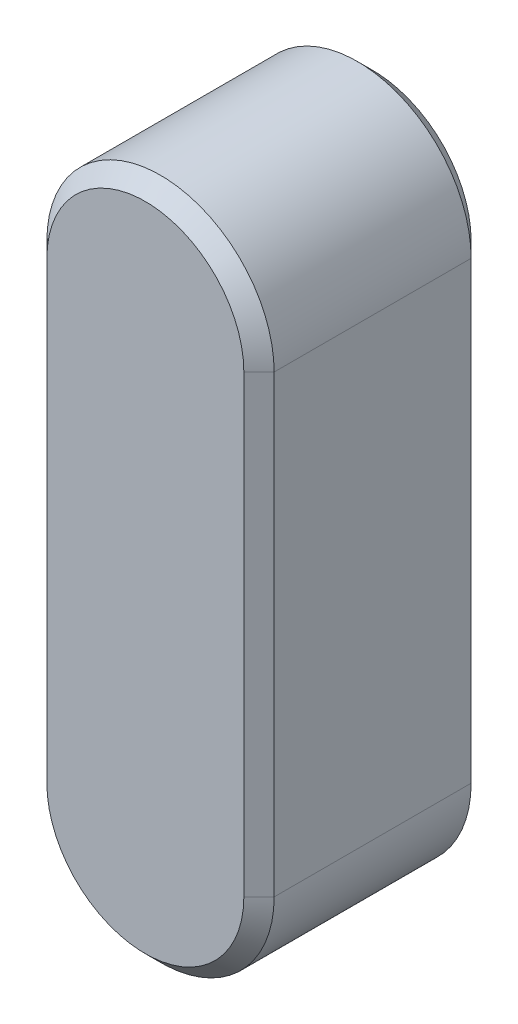
ISO-10303-21;
HEADER;
FILE_DESCRIPTION(('STEP AP214'),'2;1');
FILE_NAME('part.step','',(''),(''),'','','');
FILE_SCHEMA(('AUTOMOTIVE_DESIGN { 1 0 10303 214 1 1 1 1 }'));
ENDSEC;
DATA;
#1=APPLICATION_CONTEXT('core data for automotive mechanical design processes');
#2=APPLICATION_PROTOCOL_DEFINITION('international standard','automotive_design',2000,#1);
#3=PRODUCT_CONTEXT('',#1,'mechanical');
#4=PRODUCT('Part','Part','',(#3));
#5=PRODUCT_RELATED_PRODUCT_CATEGORY('part','',(#4));
#6=PRODUCT_DEFINITION_FORMATION('','',#4);
#7=PRODUCT_DEFINITION_CONTEXT('part definition',#1,'design');
#8=PRODUCT_DEFINITION('design','',#6,#7);
#9=PRODUCT_DEFINITION_SHAPE('','',#8);
#10=(LENGTH_UNIT() NAMED_UNIT(*) SI_UNIT(.MILLI.,.METRE.));
#11=(NAMED_UNIT(*) PLANE_ANGLE_UNIT() SI_UNIT($,.RADIAN.));
#12=(NAMED_UNIT(*) SI_UNIT($,.STERADIAN.) SOLID_ANGLE_UNIT());
#13=UNCERTAINTY_MEASURE_WITH_UNIT(LENGTH_MEASURE(1.E-05),#10,'distance_accuracy_value','');
#14=(GEOMETRIC_REPRESENTATION_CONTEXT(3) GLOBAL_UNCERTAINTY_ASSIGNED_CONTEXT((#13)) GLOBAL_UNIT_ASSIGNED_CONTEXT((#10,
#11,#12)) REPRESENTATION_CONTEXT('',''));
#15=CARTESIAN_POINT('',(0.,0.,0.));
#16=DIRECTION('',(0.,0.,1.));
#17=DIRECTION('',(1.,0.,0.));
#18=AXIS2_PLACEMENT_3D('',#15,#16,#17);
#19=CARTESIAN_POINT('',(0.,0.,3.));
#20=DIRECTION('',(0.,0.,-1.));
#21=DIRECTION('',(-1.,0.,0.));
#22=AXIS2_PLACEMENT_3D('',#19,#20,#21);
#23=CYLINDRICAL_SURFACE('',#22,1.5);
#24=DIRECTION('',(0.,0.,-1.));
#25=VECTOR('',#24,1.);
#26=CARTESIAN_POINT('',(-1.5,0.,3.));
#27=LINE('',#26,#25);
#28=CARTESIAN_POINT('',(-1.5,0.,2.8));
#29=VERTEX_POINT('',#28);
#30=CARTESIAN_POINT('',(-1.5,0.,0.200000000000001));
#31=VERTEX_POINT('',#30);
#32=EDGE_CURVE('E158',#29,#31,#27,.T.);
#33=ORIENTED_EDGE('',*,*,#32,.T.);
#34=CARTESIAN_POINT('',(0.,0.,0.200000000000001));
#35=DIRECTION('',(0.,0.,1.));
#36=DIRECTION('',(1.,0.,0.));
#37=AXIS2_PLACEMENT_3D('',#34,#35,#36);
#38=CIRCLE('',#37,1.5);
#39=CARTESIAN_POINT('',(1.5,0.,0.200000000000001));
#40=VERTEX_POINT('',#39);
#41=EDGE_CURVE('E172',#31,#40,#38,.T.);
#42=ORIENTED_EDGE('',*,*,#41,.T.);
#43=DIRECTION('',(0.,0.,-1.));
#44=VECTOR('',#43,1.);
#45=CARTESIAN_POINT('',(1.5,0.,3.));
#46=LINE('',#45,#44);
#47=CARTESIAN_POINT('',(1.5,0.,2.8));
#48=VERTEX_POINT('',#47);
#49=EDGE_CURVE('E129',#48,#40,#46,.T.);
#50=ORIENTED_EDGE('',*,*,#49,.F.);
#51=CARTESIAN_POINT('',(0.,0.,2.8));
#52=DIRECTION('',(0.,0.,1.));
#53=DIRECTION('',(1.,0.,0.));
#54=AXIS2_PLACEMENT_3D('',#51,#52,#53);
#55=CIRCLE('',#54,1.5);
#56=EDGE_CURVE('E175',#48,#29,#55,.F.);
#57=ORIENTED_EDGE('',*,*,#56,.T.);
#58=EDGE_LOOP('',(#33,#42,#50,#57));
#59=FACE_BOUND('',#58,.T.);
#60=ADVANCED_FACE('F39',(#59),#23,.T.);
#61=CARTESIAN_POINT('',(1.5,0.,3.));
#62=DIRECTION('',(-1.,0.,0.));
#63=DIRECTION('',(0.,0.,1.));
#64=AXIS2_PLACEMENT_3D('',#61,#62,#63);
#65=PLANE('',#64);
#66=ORIENTED_EDGE('',*,*,#49,.T.);
#67=DIRECTION('',(0.,1.,0.));
#68=VECTOR('',#67,1.);
#69=CARTESIAN_POINT('',(1.5,0.,0.200000000000001));
#70=LINE('',#69,#68);
#71=CARTESIAN_POINT('',(1.5,6.,0.200000000000001));
#72=VERTEX_POINT('',#71);
#73=EDGE_CURVE('E127',#40,#72,#70,.T.);
#74=ORIENTED_EDGE('',*,*,#73,.T.);
#75=DIRECTION('',(0.,0.,-1.));
#76=VECTOR('',#75,1.);
#77=CARTESIAN_POINT('',(1.5,6.,3.));
#78=LINE('',#77,#76);
#79=CARTESIAN_POINT('',(1.5,6.,2.8));
#80=VERTEX_POINT('',#79);
#81=EDGE_CURVE('E109',#80,#72,#78,.T.);
#82=ORIENTED_EDGE('',*,*,#81,.F.);
#83=DIRECTION('',(0.,-1.,0.));
#84=VECTOR('',#83,1.);
#85=CARTESIAN_POINT('',(1.5,0.,2.8));
#86=LINE('',#85,#84);
#87=EDGE_CURVE('E124',#80,#48,#86,.T.);
#88=ORIENTED_EDGE('',*,*,#87,.T.);
#89=EDGE_LOOP('',(#66,#74,#82,#88));
#90=FACE_BOUND('',#89,.T.);
#91=ADVANCED_FACE('F123',(#90),#65,.F.);
#92=CARTESIAN_POINT('',(0.,6.,3.));
#93=DIRECTION('',(0.,0.,-1.));
#94=DIRECTION('',(-1.,0.,0.));
#95=AXIS2_PLACEMENT_3D('',#92,#93,#94);
#96=CYLINDRICAL_SURFACE('',#95,1.5);
#97=ORIENTED_EDGE('',*,*,#81,.T.);
#98=CARTESIAN_POINT('',(0.,6.,0.200000000000001));
#99=DIRECTION('',(0.,0.,1.));
#100=DIRECTION('',(1.,0.,0.));
#101=AXIS2_PLACEMENT_3D('',#98,#99,#100);
#102=CIRCLE('',#101,1.5);
#103=CARTESIAN_POINT('',(-1.5,6.,0.200000000000001));
#104=VERTEX_POINT('',#103);
#105=EDGE_CURVE('E116',#72,#104,#102,.T.);
#106=ORIENTED_EDGE('',*,*,#105,.T.);
#107=DIRECTION('',(0.,0.,-1.));
#108=VECTOR('',#107,1.);
#109=CARTESIAN_POINT('',(-1.5,6.,3.));
#110=LINE('',#109,#108);
#111=CARTESIAN_POINT('',(-1.5,6.,2.8));
#112=VERTEX_POINT('',#111);
#113=EDGE_CURVE('E111',#112,#104,#110,.T.);
#114=ORIENTED_EDGE('',*,*,#113,.F.);
#115=CARTESIAN_POINT('',(0.,6.,2.8));
#116=DIRECTION('',(0.,0.,1.));
#117=DIRECTION('',(1.,0.,0.));
#118=AXIS2_PLACEMENT_3D('',#115,#116,#117);
#119=CIRCLE('',#118,1.5);
#120=EDGE_CURVE('E106',#112,#80,#119,.F.);
#121=ORIENTED_EDGE('',*,*,#120,.T.);
#122=EDGE_LOOP('',(#97,#106,#114,#121));
#123=FACE_BOUND('',#122,.T.);
#124=ADVANCED_FACE('F108',(#123),#96,.T.);
#125=CARTESIAN_POINT('',(-1.5,0.,3.));
#126=DIRECTION('',(1.,0.,0.));
#127=DIRECTION('',(0.,0.,-1.));
#128=AXIS2_PLACEMENT_3D('',#125,#126,#127);
#129=PLANE('',#128);
#130=ORIENTED_EDGE('',*,*,#113,.T.);
#131=DIRECTION('',(0.,-1.,0.));
#132=VECTOR('',#131,1.);
#133=CARTESIAN_POINT('',(-1.5,0.,0.200000000000001));
#134=LINE('',#133,#132);
#135=EDGE_CURVE('E178',#104,#31,#134,.T.);
#136=ORIENTED_EDGE('',*,*,#135,.T.);
#137=ORIENTED_EDGE('',*,*,#32,.F.);
#138=DIRECTION('',(0.,1.,0.));
#139=VECTOR('',#138,1.);
#140=CARTESIAN_POINT('',(-1.5,6.,2.8));
#141=LINE('',#140,#139);
#142=EDGE_CURVE('E181',#29,#112,#141,.T.);
#143=ORIENTED_EDGE('',*,*,#142,.T.);
#144=EDGE_LOOP('',(#130,#136,#137,#143));
#145=FACE_BOUND('',#144,.T.);
#146=ADVANCED_FACE('F229',(#145),#129,.F.);
#147=CARTESIAN_POINT('',(0.,0.,3.));
#148=DIRECTION('',(0.,0.,1.));
#149=DIRECTION('',(1.,0.,0.));
#150=AXIS2_PLACEMENT_3D('',#147,#148,#149);
#151=PLANE('',#150);
#152=CARTESIAN_POINT('',(0.,6.,3.));
#153=DIRECTION('',(0.,0.,1.));
#154=DIRECTION('',(1.,0.,0.));
#155=AXIS2_PLACEMENT_3D('',#152,#153,#154);
#156=CIRCLE('',#155,1.3);
#157=CARTESIAN_POINT('',(1.3,6.,3.));
#158=VERTEX_POINT('',#157);
#159=CARTESIAN_POINT('',(-1.3,6.,3.));
#160=VERTEX_POINT('',#159);
#161=EDGE_CURVE('E49',#158,#160,#156,.T.);
#162=ORIENTED_EDGE('',*,*,#161,.T.);
#163=DIRECTION('',(0.,-1.,0.));
#164=VECTOR('',#163,1.);
#165=CARTESIAN_POINT('',(-1.3,0.,3.));
#166=LINE('',#165,#164);
#167=CARTESIAN_POINT('',(-1.3,0.,3.));
#168=VERTEX_POINT('',#167);
#169=EDGE_CURVE('E11',#160,#168,#166,.T.);
#170=ORIENTED_EDGE('',*,*,#169,.T.);
#171=CARTESIAN_POINT('',(0.,0.,3.));
#172=DIRECTION('',(0.,0.,1.));
#173=DIRECTION('',(1.,0.,0.));
#174=AXIS2_PLACEMENT_3D('',#171,#172,#173);
#175=CIRCLE('',#174,1.3);
#176=CARTESIAN_POINT('',(1.3,0.,3.));
#177=VERTEX_POINT('',#176);
#178=EDGE_CURVE('E169',#168,#177,#175,.T.);
#179=ORIENTED_EDGE('',*,*,#178,.T.);
#180=DIRECTION('',(0.,1.,0.));
#181=VECTOR('',#180,1.);
#182=CARTESIAN_POINT('',(1.3,6.,3.));
#183=LINE('',#182,#181);
#184=EDGE_CURVE('E60',#177,#158,#183,.T.);
#185=ORIENTED_EDGE('',*,*,#184,.T.);
#186=EDGE_LOOP('',(#162,#170,#179,#185));
#187=FACE_BOUND('',#186,.T.);
#188=ADVANCED_FACE('F235',(#187),#151,.T.);
#189=CARTESIAN_POINT('',(0.,0.,0.));
#190=DIRECTION('',(0.,0.,1.));
#191=DIRECTION('',(1.,0.,0.));
#192=AXIS2_PLACEMENT_3D('',#189,#190,#191);
#193=PLANE('',#192);
#194=CARTESIAN_POINT('',(0.,6.,0.));
#195=DIRECTION('',(0.,0.,1.));
#196=DIRECTION('',(1.,0.,0.));
#197=AXIS2_PLACEMENT_3D('',#194,#195,#196);
#198=CIRCLE('',#197,1.3);
#199=CARTESIAN_POINT('',(-1.3,6.,0.));
#200=VERTEX_POINT('',#199);
#201=CARTESIAN_POINT('',(1.3,6.,0.));
#202=VERTEX_POINT('',#201);
#203=EDGE_CURVE('E189',#200,#202,#198,.F.);
#204=ORIENTED_EDGE('',*,*,#203,.T.);
#205=DIRECTION('',(0.,-1.,0.));
#206=VECTOR('',#205,1.);
#207=CARTESIAN_POINT('',(1.3,0.,0.));
#208=LINE('',#207,#206);
#209=CARTESIAN_POINT('',(1.3,0.,0.));
#210=VERTEX_POINT('',#209);
#211=EDGE_CURVE('E117',#202,#210,#208,.T.);
#212=ORIENTED_EDGE('',*,*,#211,.T.);
#213=CARTESIAN_POINT('',(0.,0.,0.));
#214=DIRECTION('',(0.,0.,1.));
#215=DIRECTION('',(1.,0.,0.));
#216=AXIS2_PLACEMENT_3D('',#213,#214,#215);
#217=CIRCLE('',#216,1.3);
#218=CARTESIAN_POINT('',(-1.3,0.,0.));
#219=VERTEX_POINT('',#218);
#220=EDGE_CURVE('E195',#210,#219,#217,.F.);
#221=ORIENTED_EDGE('',*,*,#220,.T.);
#222=DIRECTION('',(0.,1.,0.));
#223=VECTOR('',#222,1.);
#224=CARTESIAN_POINT('',(-1.3,0.,0.));
#225=LINE('',#224,#223);
#226=EDGE_CURVE('E192',#219,#200,#225,.T.);
#227=ORIENTED_EDGE('',*,*,#226,.T.);
#228=EDGE_LOOP('',(#204,#212,#221,#227));
#229=FACE_BOUND('',#228,.T.);
#230=ADVANCED_FACE('F237',(#229),#193,.F.);
#231=CARTESIAN_POINT('',(-1.5,0.,0.200000000000001));
#232=DIRECTION('',(0.707106781186547,0.,0.707106781186548));
#233=DIRECTION('',(0.,-1.,0.));
#234=AXIS2_PLACEMENT_3D('',#231,#232,#233);
#235=PLANE('',#234);
#236=DIRECTION('',(-0.707106781186548,0.,0.707106781186547));
#237=VECTOR('',#236,1.);
#238=CARTESIAN_POINT('',(-1.3,6.,0.));
#239=LINE('',#238,#237);
#240=EDGE_CURVE('E159',#200,#104,#239,.T.);
#241=ORIENTED_EDGE('',*,*,#240,.F.);
#242=ORIENTED_EDGE('',*,*,#226,.F.);
#243=DIRECTION('',(0.707106781186548,0.,-0.707106781186547));
#244=VECTOR('',#243,1.);
#245=CARTESIAN_POINT('',(-1.5,0.,0.200000000000001));
#246=LINE('',#245,#244);
#247=EDGE_CURVE('E154',#31,#219,#246,.T.);
#248=ORIENTED_EDGE('',*,*,#247,.F.);
#249=ORIENTED_EDGE('',*,*,#135,.F.);
#250=EDGE_LOOP('',(#241,#242,#248,#249));
#251=FACE_BOUND('',#250,.T.);
#252=ADVANCED_FACE('F216',(#251),#235,.F.);
#253=CARTESIAN_POINT('',(0.,0.,0.200000000000001));
#254=DIRECTION('',(0.,0.,1.));
#255=DIRECTION('',(1.,0.,0.));
#256=AXIS2_PLACEMENT_3D('',#253,#254,#255);
#257=CONICAL_SURFACE('',#256,1.5,0.785398163397449);
#258=ORIENTED_EDGE('',*,*,#247,.T.);
#259=ORIENTED_EDGE('',*,*,#220,.F.);
#260=DIRECTION('',(-0.707106781186548,0.,-0.707106781186547));
#261=VECTOR('',#260,1.);
#262=CARTESIAN_POINT('',(1.5,0.,0.200000000000001));
#263=LINE('',#262,#261);
#264=EDGE_CURVE('E143',#40,#210,#263,.T.);
#265=ORIENTED_EDGE('',*,*,#264,.F.);
#266=ORIENTED_EDGE('',*,*,#41,.F.);
#267=EDGE_LOOP('',(#258,#259,#265,#266));
#268=FACE_BOUND('',#267,.T.);
#269=ADVANCED_FACE('F220',(#268),#257,.T.);
#270=CARTESIAN_POINT('',(0.,6.,0.200000000000001));
#271=DIRECTION('',(0.,0.,1.));
#272=DIRECTION('',(1.,0.,0.));
#273=AXIS2_PLACEMENT_3D('',#270,#271,#272);
#274=CONICAL_SURFACE('',#273,1.5,0.785398163397449);
#275=ORIENTED_EDGE('',*,*,#240,.T.);
#276=ORIENTED_EDGE('',*,*,#105,.F.);
#277=DIRECTION('',(0.707106781186548,0.,0.707106781186547));
#278=VECTOR('',#277,1.);
#279=CARTESIAN_POINT('',(1.3,6.,0.));
#280=LINE('',#279,#278);
#281=EDGE_CURVE('E140',#202,#72,#280,.T.);
#282=ORIENTED_EDGE('',*,*,#281,.F.);
#283=ORIENTED_EDGE('',*,*,#203,.F.);
#284=EDGE_LOOP('',(#275,#276,#282,#283));
#285=FACE_BOUND('',#284,.T.);
#286=ADVANCED_FACE('F228',(#285),#274,.T.);
#287=CARTESIAN_POINT('',(1.5,0.,0.200000000000001));
#288=DIRECTION('',(-0.707106781186547,0.,0.707106781186548));
#289=DIRECTION('',(0.,1.,0.));
#290=AXIS2_PLACEMENT_3D('',#287,#288,#289);
#291=PLANE('',#290);
#292=ORIENTED_EDGE('',*,*,#264,.T.);
#293=ORIENTED_EDGE('',*,*,#211,.F.);
#294=ORIENTED_EDGE('',*,*,#281,.T.);
#295=ORIENTED_EDGE('',*,*,#73,.F.);
#296=EDGE_LOOP('',(#292,#293,#294,#295));
#297=FACE_BOUND('',#296,.T.);
#298=ADVANCED_FACE('F223',(#297),#291,.F.);
#299=CARTESIAN_POINT('',(1.3,0.,3.));
#300=DIRECTION('',(0.70710678118655,0.,0.707106781186545));
#301=DIRECTION('',(0.,-1.,0.));
#302=AXIS2_PLACEMENT_3D('',#299,#300,#301);
#303=PLANE('',#302);
#304=DIRECTION('',(-0.707106781186545,0.,0.70710678118655));
#305=VECTOR('',#304,1.);
#306=CARTESIAN_POINT('',(1.5,0.,2.8));
#307=LINE('',#306,#305);
#308=EDGE_CURVE('E134',#48,#177,#307,.T.);
#309=ORIENTED_EDGE('',*,*,#308,.F.);
#310=ORIENTED_EDGE('',*,*,#87,.F.);
#311=DIRECTION('',(0.707106781186545,0.,-0.70710678118655));
#312=VECTOR('',#311,1.);
#313=CARTESIAN_POINT('',(1.3,6.,3.));
#314=LINE('',#313,#312);
#315=EDGE_CURVE('E43',#158,#80,#314,.T.);
#316=ORIENTED_EDGE('',*,*,#315,.F.);
#317=ORIENTED_EDGE('',*,*,#184,.F.);
#318=EDGE_LOOP('',(#309,#310,#316,#317));
#319=FACE_BOUND('',#318,.T.);
#320=ADVANCED_FACE('F41',(#319),#303,.T.);
#321=CARTESIAN_POINT('',(0.,6.,3.));
#322=DIRECTION('',(0.,0.,-1.));
#323=DIRECTION('',(-1.,0.,0.));
#324=AXIS2_PLACEMENT_3D('',#321,#322,#323);
#325=CONICAL_SURFACE('',#324,1.3,0.785398163397445);
#326=ORIENTED_EDGE('',*,*,#315,.T.);
#327=ORIENTED_EDGE('',*,*,#120,.F.);
#328=DIRECTION('',(-0.707106781186545,0.,-0.70710678118655));
#329=VECTOR('',#328,1.);
#330=CARTESIAN_POINT('',(-1.3,6.,3.));
#331=LINE('',#330,#329);
#332=EDGE_CURVE('E145',#160,#112,#331,.T.);
#333=ORIENTED_EDGE('',*,*,#332,.F.);
#334=ORIENTED_EDGE('',*,*,#161,.F.);
#335=EDGE_LOOP('',(#326,#327,#333,#334));
#336=FACE_BOUND('',#335,.T.);
#337=ADVANCED_FACE('F138',(#336),#325,.T.);
#338=CARTESIAN_POINT('',(0.,0.,3.));
#339=DIRECTION('',(0.,0.,-1.));
#340=DIRECTION('',(-1.,0.,0.));
#341=AXIS2_PLACEMENT_3D('',#338,#339,#340);
#342=CONICAL_SURFACE('',#341,1.3,0.785398163397445);
#343=ORIENTED_EDGE('',*,*,#308,.T.);
#344=ORIENTED_EDGE('',*,*,#178,.F.);
#345=DIRECTION('',(0.707106781186545,0.,0.70710678118655));
#346=VECTOR('',#345,1.);
#347=CARTESIAN_POINT('',(-1.5,0.,2.8));
#348=LINE('',#347,#346);
#349=EDGE_CURVE('E149',#29,#168,#348,.T.);
#350=ORIENTED_EDGE('',*,*,#349,.F.);
#351=ORIENTED_EDGE('',*,*,#56,.F.);
#352=EDGE_LOOP('',(#343,#344,#350,#351));
#353=FACE_BOUND('',#352,.T.);
#354=ADVANCED_FACE('F234',(#353),#342,.T.);
#355=CARTESIAN_POINT('',(-1.3,0.,3.));
#356=DIRECTION('',(-0.70710678118655,0.,0.707106781186545));
#357=DIRECTION('',(0.,1.,0.));
#358=AXIS2_PLACEMENT_3D('',#355,#356,#357);
#359=PLANE('',#358);
#360=ORIENTED_EDGE('',*,*,#332,.T.);
#361=ORIENTED_EDGE('',*,*,#142,.F.);
#362=ORIENTED_EDGE('',*,*,#349,.T.);
#363=ORIENTED_EDGE('',*,*,#169,.F.);
#364=EDGE_LOOP('',(#360,#361,#362,#363));
#365=FACE_BOUND('',#364,.T.);
#366=ADVANCED_FACE('F232',(#365),#359,.T.);
#367=CLOSED_SHELL('',(#60,#91,#124,#146,#188,#230,#252,#269,#286,#298,#320,#337,#354,#366));
#368=MANIFOLD_SOLID_BREP('B2',#367);
#369=ADVANCED_BREP_SHAPE_REPRESENTATION('',(#18,#368),#14);
#370=SHAPE_DEFINITION_REPRESENTATION(#9,#369);
ENDSEC;
END-ISO-10303-21;
